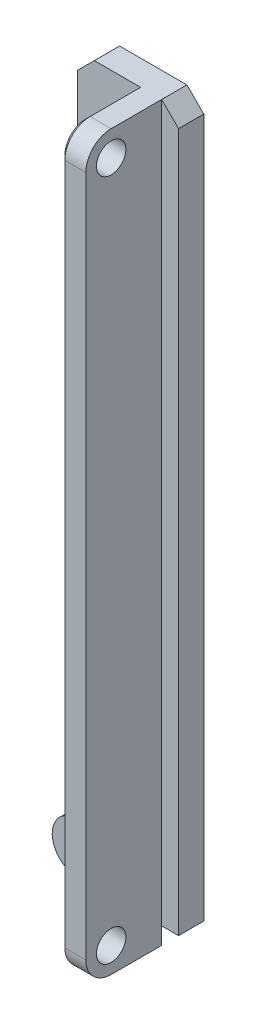
ISO-10303-21;
HEADER;
FILE_DESCRIPTION(('STEP AP214'),'2;1');
FILE_NAME('part.step','',(''),(''),'','','');
FILE_SCHEMA(('AUTOMOTIVE_DESIGN { 1 0 10303 214 1 1 1 1 }'));
ENDSEC;
DATA;
#1=APPLICATION_CONTEXT('core data for automotive mechanical design processes');
#2=APPLICATION_PROTOCOL_DEFINITION('international standard','automotive_design',2000,#1);
#3=PRODUCT_CONTEXT('',#1,'mechanical');
#4=PRODUCT('Part','Part','',(#3));
#5=PRODUCT_RELATED_PRODUCT_CATEGORY('part','',(#4));
#6=PRODUCT_DEFINITION_FORMATION('','',#4);
#7=PRODUCT_DEFINITION_CONTEXT('part definition',#1,'design');
#8=PRODUCT_DEFINITION('design','',#6,#7);
#9=PRODUCT_DEFINITION_SHAPE('','',#8);
#10=(LENGTH_UNIT() NAMED_UNIT(*) SI_UNIT(.MILLI.,.METRE.));
#11=(NAMED_UNIT(*) PLANE_ANGLE_UNIT() SI_UNIT($,.RADIAN.));
#12=(NAMED_UNIT(*) SI_UNIT($,.STERADIAN.) SOLID_ANGLE_UNIT());
#13=UNCERTAINTY_MEASURE_WITH_UNIT(LENGTH_MEASURE(1.E-05),#10,'distance_accuracy_value','');
#14=(GEOMETRIC_REPRESENTATION_CONTEXT(3) GLOBAL_UNCERTAINTY_ASSIGNED_CONTEXT((#13)) GLOBAL_UNIT_ASSIGNED_CONTEXT((#10,
#11,#12)) REPRESENTATION_CONTEXT('',''));
#15=CARTESIAN_POINT('',(0.,0.,0.));
#16=DIRECTION('',(0.,0.,1.));
#17=DIRECTION('',(1.,0.,0.));
#18=AXIS2_PLACEMENT_3D('',#15,#16,#17);
#19=CARTESIAN_POINT('',(-6.99999992549419,-10.,-6.));
#20=DIRECTION('',(0.,0.,1.));
#21=DIRECTION('',(1.,0.,0.));
#22=AXIS2_PLACEMENT_3D('',#19,#20,#21);
#23=PLANE('',#22);
#24=DIRECTION('',(0.,1.,0.));
#25=VECTOR('',#24,1.);
#26=CARTESIAN_POINT('',(5.00000007450581,-13.,-6.));
#27=LINE('',#26,#25);
#28=CARTESIAN_POINT('',(5.00000007450581,-13.,-6.));
#29=VERTEX_POINT('',#28);
#30=CARTESIAN_POINT('',(5.00000007450581,69.9999999971164,-6.));
#31=VERTEX_POINT('',#30);
#32=EDGE_CURVE('E215',#29,#31,#27,.T.);
#33=ORIENTED_EDGE('',*,*,#32,.T.);
#34=DIRECTION('',(0.707106591525709,-0.707106970847335,0.));
#35=VECTOR('',#34,1.);
#36=CARTESIAN_POINT('',(39.000003291709,35.9999785408858,-6.));
#37=LINE('',#36,#35);
#38=CARTESIAN_POINT('',(3.,72.0000010728836,-6.));
#39=VERTEX_POINT('',#38);
#40=EDGE_CURVE('E209',#31,#39,#37,.F.);
#41=ORIENTED_EDGE('',*,*,#40,.T.);
#42=DIRECTION('',(0.,-1.,0.));
#43=VECTOR('',#42,1.);
#44=CARTESIAN_POINT('',(3.,72.0000010728836,-6.));
#45=LINE('',#44,#43);
#46=CARTESIAN_POINT('',(3.,-13.,-6.));
#47=VERTEX_POINT('',#46);
#48=EDGE_CURVE('E212',#39,#47,#45,.T.);
#49=ORIENTED_EDGE('',*,*,#48,.T.);
#50=DIRECTION('',(1.,0.,0.));
#51=VECTOR('',#50,1.);
#52=CARTESIAN_POINT('',(-6.9999999254942,-13.,-6.));
#53=LINE('',#52,#51);
#54=EDGE_CURVE('E392',#47,#29,#53,.T.);
#55=ORIENTED_EDGE('',*,*,#54,.T.);
#56=EDGE_LOOP('',(#33,#41,#49,#55));
#57=FACE_BOUND('',#56,.T.);
#58=ADVANCED_FACE('F35',(#57),#23,.T.);
#59=CARTESIAN_POINT('',(-6.9999999254942,-13.,-9.));
#60=DIRECTION('',(0.,-1.,0.));
#61=DIRECTION('',(0.,0.,-1.));
#62=AXIS2_PLACEMENT_3D('',#59,#60,#61);
#63=PLANE('',#62);
#64=DIRECTION('',(0.,0.,-1.));
#65=VECTOR('',#64,1.);
#66=CARTESIAN_POINT('',(0.,-13.,-6.));
#67=LINE('',#66,#65);
#68=CARTESIAN_POINT('',(0.,-13.,-6.));
#69=VERTEX_POINT('',#68);
#70=CARTESIAN_POINT('',(0.,-13.,-9.));
#71=VERTEX_POINT('',#70);
#72=EDGE_CURVE('E343',#69,#71,#67,.T.);
#73=ORIENTED_EDGE('',*,*,#72,.T.);
#74=DIRECTION('',(1.,0.,0.));
#75=VECTOR('',#74,1.);
#76=CARTESIAN_POINT('',(-6.9999999254942,-13.,-9.));
#77=LINE('',#76,#75);
#78=CARTESIAN_POINT('',(5.00000007450581,-13.,-9.));
#79=VERTEX_POINT('',#78);
#80=EDGE_CURVE('E380',#71,#79,#77,.T.);
#81=ORIENTED_EDGE('',*,*,#80,.T.);
#82=DIRECTION('',(0.,0.,1.));
#83=VECTOR('',#82,1.);
#84=CARTESIAN_POINT('',(5.00000007450581,-13.,-9.));
#85=LINE('',#84,#83);
#86=EDGE_CURVE('E396',#79,#29,#85,.T.);
#87=ORIENTED_EDGE('',*,*,#86,.T.);
#88=ORIENTED_EDGE('',*,*,#54,.F.);
#89=EDGE_CURVE('E395',#69,#47,#53,.T.);
#90=ORIENTED_EDGE('',*,*,#89,.F.);
#91=EDGE_LOOP('',(#73,#81,#87,#88,#90));
#92=FACE_BOUND('',#91,.T.);
#93=ADVANCED_FACE('F483',(#92),#63,.T.);
#94=CARTESIAN_POINT('',(-6.99999992549421,72.00000107,-9.));
#95=DIRECTION('',(-1.,0.,0.));
#96=DIRECTION('',(0.,-1.,0.));
#97=AXIS2_PLACEMENT_3D('',#94,#95,#96);
#98=PLANE('',#97);
#99=DIRECTION('',(0.,-1.,0.));
#100=VECTOR('',#99,1.);
#101=CARTESIAN_POINT('',(-6.99999992549421,72.00000107,-6.));
#102=LINE('',#101,#100);
#103=CARTESIAN_POINT('',(-6.9999999254942,0.,-6.));
#104=VERTEX_POINT('',#103);
#105=CARTESIAN_POINT('',(-6.9999999254942,-7.,-6.));
#106=VERTEX_POINT('',#105);
#107=EDGE_CURVE('E387',#104,#106,#102,.T.);
#108=ORIENTED_EDGE('',*,*,#107,.F.);
#109=DIRECTION('',(0.,0.,1.));
#110=VECTOR('',#109,1.);
#111=CARTESIAN_POINT('',(-6.9999999254942,0.,-6.));
#112=LINE('',#111,#110);
#113=CARTESIAN_POINT('',(-6.9999999254942,0.,-9.));
#114=VERTEX_POINT('',#113);
#115=EDGE_CURVE('E346',#114,#104,#112,.T.);
#116=ORIENTED_EDGE('',*,*,#115,.F.);
#117=DIRECTION('',(0.,-1.,0.));
#118=VECTOR('',#117,1.);
#119=CARTESIAN_POINT('',(-6.99999992549421,72.00000107,-9.));
#120=LINE('',#119,#118);
#121=CARTESIAN_POINT('',(-6.9999999254942,-7.,-9.));
#122=VERTEX_POINT('',#121);
#123=EDGE_CURVE('E375',#114,#122,#120,.T.);
#124=ORIENTED_EDGE('',*,*,#123,.T.);
#125=DIRECTION('',(0.,0.,1.));
#126=VECTOR('',#125,1.);
#127=CARTESIAN_POINT('',(-6.9999999254942,-7.,-9.));
#128=LINE('',#127,#126);
#129=EDGE_CURVE('E384',#122,#106,#128,.T.);
#130=ORIENTED_EDGE('',*,*,#129,.T.);
#131=EDGE_LOOP('',(#108,#116,#124,#130));
#132=FACE_BOUND('',#131,.T.);
#133=ADVANCED_FACE('F485',(#132),#98,.T.);
#134=CARTESIAN_POINT('',(5.00000007450581,-13.,-9.));
#135=DIRECTION('',(1.,0.,0.));
#136=DIRECTION('',(0.,0.,-1.));
#137=AXIS2_PLACEMENT_3D('',#134,#135,#136);
#138=PLANE('',#137);
#139=DIRECTION('',(0.,1.,0.));
#140=VECTOR('',#139,1.);
#141=CARTESIAN_POINT('',(5.00000007450581,-13.,-9.));
#142=LINE('',#141,#140);
#143=CARTESIAN_POINT('',(5.00000007450581,69.9999999971164,-9.));
#144=VERTEX_POINT('',#143);
#145=EDGE_CURVE('E369',#79,#144,#142,.T.);
#146=ORIENTED_EDGE('',*,*,#145,.T.);
#147=DIRECTION('',(0.,0.,1.));
#148=VECTOR('',#147,1.);
#149=CARTESIAN_POINT('',(5.00000007450581,69.9999999971164,-9.));
#150=LINE('',#149,#148);
#151=EDGE_CURVE('E221',#144,#31,#150,.T.);
#152=ORIENTED_EDGE('',*,*,#151,.T.);
#153=ORIENTED_EDGE('',*,*,#32,.F.);
#154=ORIENTED_EDGE('',*,*,#86,.F.);
#155=EDGE_LOOP('',(#146,#152,#153,#154));
#156=FACE_BOUND('',#155,.T.);
#157=ADVANCED_FACE('F432',(#156),#138,.T.);
#158=DIRECTION('',(0.,0.,-1.));
#159=VECTOR('',#158,1.);
#160=CARTESIAN_POINT('',(-3.,-13.,-6.));
#161=LINE('',#160,#159);
#162=CARTESIAN_POINT('',(-3.,-13.,-6.));
#163=VERTEX_POINT('',#162);
#164=CARTESIAN_POINT('',(-3.,-13.,-9.));
#165=VERTEX_POINT('',#164);
#166=EDGE_CURVE('E330',#163,#165,#161,.T.);
#167=ORIENTED_EDGE('',*,*,#166,.F.);
#168=CARTESIAN_POINT('',(-6.9999999254942,-13.,-6.));
#169=VERTEX_POINT('',#168);
#170=EDGE_CURVE('E373',#169,#163,#53,.T.);
#171=ORIENTED_EDGE('',*,*,#170,.F.);
#172=DIRECTION('',(0.,0.,1.));
#173=VECTOR('',#172,1.);
#174=CARTESIAN_POINT('',(-6.9999999254942,-13.,-9.));
#175=LINE('',#174,#173);
#176=CARTESIAN_POINT('',(-6.9999999254942,-13.,-9.));
#177=VERTEX_POINT('',#176);
#178=EDGE_CURVE('E400',#177,#169,#175,.T.);
#179=ORIENTED_EDGE('',*,*,#178,.F.);
#180=EDGE_CURVE('E381',#177,#165,#77,.T.);
#181=ORIENTED_EDGE('',*,*,#180,.T.);
#182=EDGE_LOOP('',(#167,#171,#179,#181));
#183=FACE_BOUND('',#182,.T.);
#184=ADVANCED_FACE('F487',(#183),#63,.T.);
#185=CARTESIAN_POINT('',(-6.99999992549419,-10.,-9.));
#186=DIRECTION('',(0.,0.,1.));
#187=DIRECTION('',(1.,0.,0.));
#188=AXIS2_PLACEMENT_3D('',#185,#186,#187);
#189=CYLINDRICAL_SURFACE('',#188,3.);
#190=CARTESIAN_POINT('',(-6.99999992549419,-10.,-6.));
#191=DIRECTION('',(0.,0.,1.));
#192=DIRECTION('',(1.,0.,0.));
#193=AXIS2_PLACEMENT_3D('',#190,#191,#192);
#194=CIRCLE('',#193,3.);
#195=EDGE_CURVE('E389',#106,#169,#194,.T.);
#196=ORIENTED_EDGE('',*,*,#195,.F.);
#197=ORIENTED_EDGE('',*,*,#129,.F.);
#198=CARTESIAN_POINT('',(-6.99999992549419,-10.,-9.));
#199=DIRECTION('',(0.,0.,1.));
#200=DIRECTION('',(1.,0.,0.));
#201=AXIS2_PLACEMENT_3D('',#198,#199,#200);
#202=CIRCLE('',#201,3.);
#203=EDGE_CURVE('E377',#122,#177,#202,.T.);
#204=ORIENTED_EDGE('',*,*,#203,.T.);
#205=ORIENTED_EDGE('',*,*,#178,.T.);
#206=EDGE_LOOP('',(#196,#197,#204,#205));
#207=FACE_BOUND('',#206,.T.);
#208=ADVANCED_FACE('F497',(#207),#189,.T.);
#209=CARTESIAN_POINT('',(5.00000007450581,72.00000107,-9.));
#210=DIRECTION('',(0.,1.,0.));
#211=DIRECTION('',(0.,0.,1.));
#212=AXIS2_PLACEMENT_3D('',#209,#210,#211);
#213=PLANE('',#212);
#214=DIRECTION('',(-1.,0.,0.));
#215=VECTOR('',#214,1.);
#216=CARTESIAN_POINT('',(5.00000007450581,72.00000107,-6.));
#217=LINE('',#216,#215);
#218=CARTESIAN_POINT('',(0.49999999711639,72.00000107,-6.));
#219=VERTEX_POINT('',#218);
#220=CARTESIAN_POINT('',(-4.99999992837809,72.00000107,-6.));
#221=VERTEX_POINT('',#220);
#222=EDGE_CURVE('E53',#219,#221,#217,.T.);
#223=ORIENTED_EDGE('',*,*,#222,.F.);
#224=DIRECTION('',(0.,0.,1.));
#225=VECTOR('',#224,1.);
#226=CARTESIAN_POINT('',(0.49999999711639,72.00000107,0.));
#227=LINE('',#226,#225);
#228=CARTESIAN_POINT('',(0.49999999711639,72.00000107,0.));
#229=VERTEX_POINT('',#228);
#230=EDGE_CURVE('E45',#219,#229,#227,.T.);
#231=ORIENTED_EDGE('',*,*,#230,.T.);
#232=DIRECTION('',(-1.,0.,0.));
#233=VECTOR('',#232,1.);
#234=CARTESIAN_POINT('',(5.00000007450581,72.00000107,0.));
#235=LINE('',#234,#233);
#236=CARTESIAN_POINT('',(3.,72.0000010728836,0.));
#237=VERTEX_POINT('',#236);
#238=EDGE_CURVE('E227',#229,#237,#235,.F.);
#239=ORIENTED_EDGE('',*,*,#238,.T.);
#240=DIRECTION('',(0.,0.,-1.));
#241=VECTOR('',#240,1.);
#242=CARTESIAN_POINT('',(3.,72.0000010728836,3.00000000000001));
#243=LINE('',#242,#241);
#244=EDGE_CURVE('E224',#237,#39,#243,.T.);
#245=ORIENTED_EDGE('',*,*,#244,.T.);
#246=DIRECTION('',(0.,0.,-1.));
#247=VECTOR('',#246,1.);
#248=CARTESIAN_POINT('',(3.00000007450608,72.00000107,-9.));
#249=LINE('',#248,#247);
#250=CARTESIAN_POINT('',(3.00000007450608,72.00000107,-9.));
#251=VERTEX_POINT('',#250);
#252=EDGE_CURVE('E220',#39,#251,#249,.T.);
#253=ORIENTED_EDGE('',*,*,#252,.T.);
#254=DIRECTION('',(-1.,0.,0.));
#255=VECTOR('',#254,1.);
#256=CARTESIAN_POINT('',(5.00000007450581,72.00000107,-9.));
#257=LINE('',#256,#255);
#258=CARTESIAN_POINT('',(-4.99999992837809,72.00000107,-9.));
#259=VERTEX_POINT('',#258);
#260=EDGE_CURVE('E372',#251,#259,#257,.T.);
#261=ORIENTED_EDGE('',*,*,#260,.T.);
#262=DIRECTION('',(0.,0.,1.));
#263=VECTOR('',#262,1.);
#264=CARTESIAN_POINT('',(-4.99999992837809,72.00000107,-6.));
#265=LINE('',#264,#263);
#266=EDGE_CURVE('E423',#259,#221,#265,.T.);
#267=ORIENTED_EDGE('',*,*,#266,.T.);
#268=EDGE_LOOP('',(#223,#231,#239,#245,#253,#261,#267));
#269=FACE_BOUND('',#268,.T.);
#270=ADVANCED_FACE('F225',(#269),#213,.T.);
#271=CARTESIAN_POINT('',(-6.99999992549419,-10.,-9.));
#272=DIRECTION('',(0.,0.,1.));
#273=DIRECTION('',(1.,0.,0.));
#274=AXIS2_PLACEMENT_3D('',#271,#272,#273);
#275=PLANE('',#274);
#276=ORIENTED_EDGE('',*,*,#260,.F.);
#277=DIRECTION('',(-0.707106591525709,0.707106970847335,0.));
#278=VECTOR('',#277,1.);
#279=CARTESIAN_POINT('',(5.00000007450581,69.9999999971164,-9.));
#280=LINE('',#279,#278);
#281=EDGE_CURVE('E240',#251,#144,#280,.F.);
#282=ORIENTED_EDGE('',*,*,#281,.T.);
#283=ORIENTED_EDGE('',*,*,#145,.F.);
#284=ORIENTED_EDGE('',*,*,#80,.F.);
#285=DIRECTION('',(0.,-1.,0.));
#286=VECTOR('',#285,1.);
#287=CARTESIAN_POINT('',(0.,17.,-9.));
#288=LINE('',#287,#286);
#289=CARTESIAN_POINT('',(0.,17.,-9.));
#290=VERTEX_POINT('',#289);
#291=EDGE_CURVE('E321',#290,#71,#288,.T.);
#292=ORIENTED_EDGE('',*,*,#291,.F.);
#293=DIRECTION('',(1.,0.,0.));
#294=VECTOR('',#293,1.);
#295=CARTESIAN_POINT('',(-4.5,17.,-9.));
#296=LINE('',#295,#294);
#297=CARTESIAN_POINT('',(-4.5,17.,-9.));
#298=VERTEX_POINT('',#297);
#299=EDGE_CURVE('E339',#298,#290,#296,.T.);
#300=ORIENTED_EDGE('',*,*,#299,.F.);
#301=DIRECTION('',(0.,1.,0.));
#302=VECTOR('',#301,1.);
#303=CARTESIAN_POINT('',(-4.5,15.,-9.));
#304=LINE('',#303,#302);
#305=CARTESIAN_POINT('',(-4.5,15.,-9.));
#306=VERTEX_POINT('',#305);
#307=EDGE_CURVE('E336',#306,#298,#304,.T.);
#308=ORIENTED_EDGE('',*,*,#307,.F.);
#309=DIRECTION('',(-1.,0.,0.));
#310=VECTOR('',#309,1.);
#311=CARTESIAN_POINT('',(-3.,15.,-9.));
#312=LINE('',#311,#310);
#313=CARTESIAN_POINT('',(-3.,15.,-9.));
#314=VERTEX_POINT('',#313);
#315=EDGE_CURVE('E333',#314,#306,#312,.T.);
#316=ORIENTED_EDGE('',*,*,#315,.F.);
#317=DIRECTION('',(0.,1.,0.));
#318=VECTOR('',#317,1.);
#319=CARTESIAN_POINT('',(-3.,-13.,-9.));
#320=LINE('',#319,#318);
#321=EDGE_CURVE('E316',#165,#314,#320,.T.);
#322=ORIENTED_EDGE('',*,*,#321,.F.);
#323=ORIENTED_EDGE('',*,*,#180,.F.);
#324=ORIENTED_EDGE('',*,*,#203,.F.);
#325=ORIENTED_EDGE('',*,*,#123,.F.);
#326=DIRECTION('',(1.,0.,0.));
#327=VECTOR('',#326,1.);
#328=CARTESIAN_POINT('',(-8.49999992549419,0.,-9.));
#329=LINE('',#328,#327);
#330=CARTESIAN_POINT('',(-8.49999992549419,0.,-9.));
#331=VERTEX_POINT('',#330);
#332=EDGE_CURVE('E367',#331,#114,#329,.T.);
#333=ORIENTED_EDGE('',*,*,#332,.F.);
#334=DIRECTION('',(0.,-1.,0.));
#335=VECTOR('',#334,1.);
#336=CARTESIAN_POINT('',(-8.49999992549419,0.,-9.));
#337=LINE('',#336,#335);
#338=CARTESIAN_POINT('',(-8.49999992549419,1.49999999999999,-9.));
#339=VERTEX_POINT('',#338);
#340=EDGE_CURVE('E356',#339,#331,#337,.T.);
#341=ORIENTED_EDGE('',*,*,#340,.F.);
#342=DIRECTION('',(-0.707106781186544,-0.707106781186551,0.));
#343=VECTOR('',#342,1.);
#344=CARTESIAN_POINT('',(-13.4999999254942,-3.50000000000006,-9.));
#345=LINE('',#344,#343);
#346=CARTESIAN_POINT('',(-6.99999992549419,3.,-9.));
#347=VERTEX_POINT('',#346);
#348=EDGE_CURVE('E310',#339,#347,#345,.F.);
#349=ORIENTED_EDGE('',*,*,#348,.T.);
#350=DIRECTION('',(0.,1.,0.));
#351=VECTOR('',#350,1.);
#352=CARTESIAN_POINT('',(-6.99999992549419,3.,-9.));
#353=LINE('',#352,#351);
#354=CARTESIAN_POINT('',(-6.9999999254942,70.,-9.));
#355=VERTEX_POINT('',#354);
#356=EDGE_CURVE('E306',#347,#355,#353,.T.);
#357=ORIENTED_EDGE('',*,*,#356,.T.);
#358=DIRECTION('',(0.707106591525701,0.707106970847343,0.));
#359=VECTOR('',#358,1.);
#360=CARTESIAN_POINT('',(-4.99999992837809,72.00000107,-9.));
#361=LINE('',#360,#359);
#362=EDGE_CURVE('E429',#355,#259,#361,.T.);
#363=ORIENTED_EDGE('',*,*,#362,.T.);
#364=EDGE_LOOP('',(#276,#282,#283,#284,#292,#300,#308,#316,#322,#323,#324,#325,#333,#341,#349,
#357,#363));
#365=FACE_BOUND('',#364,.T.);
#366=ADVANCED_FACE('F437',(#365),#275,.F.);
#367=ORIENTED_EDGE('',*,*,#222,.T.);
#368=DIRECTION('',(-0.707106591525701,-0.707106970847343,0.));
#369=VECTOR('',#368,1.);
#370=CARTESIAN_POINT('',(-46.9999999254884,29.9999785423276,-6.));
#371=LINE('',#370,#369);
#372=CARTESIAN_POINT('',(-6.9999999254942,70.,-6.));
#373=VERTEX_POINT('',#372);
#374=EDGE_CURVE('E425',#221,#373,#371,.T.);
#375=ORIENTED_EDGE('',*,*,#374,.T.);
#376=DIRECTION('',(0.,1.,0.));
#377=VECTOR('',#376,1.);
#378=CARTESIAN_POINT('',(-6.99999992549419,3.,-6.));
#379=LINE('',#378,#377);
#380=CARTESIAN_POINT('',(-6.99999992549419,3.,-6.));
#381=VERTEX_POINT('',#380);
#382=EDGE_CURVE('E311',#381,#373,#379,.T.);
#383=ORIENTED_EDGE('',*,*,#382,.F.);
#384=DIRECTION('',(-0.707106781186544,-0.707106781186551,0.));
#385=VECTOR('',#384,1.);
#386=CARTESIAN_POINT('',(-13.4999999254942,-3.50000000000006,-6.));
#387=LINE('',#386,#385);
#388=CARTESIAN_POINT('',(-8.49999992549419,1.49999999999999,-6.));
#389=VERTEX_POINT('',#388);
#390=EDGE_CURVE('E305',#389,#381,#387,.F.);
#391=ORIENTED_EDGE('',*,*,#390,.F.);
#392=DIRECTION('',(0.,1.,0.));
#393=VECTOR('',#392,1.);
#394=CARTESIAN_POINT('',(-8.49999992549419,72.0000010728836,-6.));
#395=LINE('',#394,#393);
#396=CARTESIAN_POINT('',(-8.49999992549419,0.,-6.));
#397=VERTEX_POINT('',#396);
#398=EDGE_CURVE('E360',#397,#389,#395,.T.);
#399=ORIENTED_EDGE('',*,*,#398,.F.);
#400=DIRECTION('',(1.,0.,0.));
#401=VECTOR('',#400,1.);
#402=CARTESIAN_POINT('',(-8.49999992549419,0.,-6.));
#403=LINE('',#402,#401);
#404=EDGE_CURVE('E363',#397,#104,#403,.T.);
#405=ORIENTED_EDGE('',*,*,#404,.T.);
#406=ORIENTED_EDGE('',*,*,#107,.T.);
#407=ORIENTED_EDGE('',*,*,#195,.T.);
#408=ORIENTED_EDGE('',*,*,#170,.T.);
#409=DIRECTION('',(0.,1.,0.));
#410=VECTOR('',#409,1.);
#411=CARTESIAN_POINT('',(-3.,-13.,-6.));
#412=LINE('',#411,#410);
#413=CARTESIAN_POINT('',(-3.,15.,-6.));
#414=VERTEX_POINT('',#413);
#415=EDGE_CURVE('E317',#163,#414,#412,.T.);
#416=ORIENTED_EDGE('',*,*,#415,.T.);
#417=DIRECTION('',(-1.,0.,0.));
#418=VECTOR('',#417,1.);
#419=CARTESIAN_POINT('',(-3.,15.,-6.));
#420=LINE('',#419,#418);
#421=CARTESIAN_POINT('',(-4.5,15.,-6.));
#422=VERTEX_POINT('',#421);
#423=EDGE_CURVE('E320',#414,#422,#420,.T.);
#424=ORIENTED_EDGE('',*,*,#423,.T.);
#425=DIRECTION('',(0.,1.,0.));
#426=VECTOR('',#425,1.);
#427=CARTESIAN_POINT('',(-4.5,15.,-6.));
#428=LINE('',#427,#426);
#429=CARTESIAN_POINT('',(-4.5,17.,-6.));
#430=VERTEX_POINT('',#429);
#431=EDGE_CURVE('E324',#422,#430,#428,.T.);
#432=ORIENTED_EDGE('',*,*,#431,.T.);
#433=DIRECTION('',(1.,0.,0.));
#434=VECTOR('',#433,1.);
#435=CARTESIAN_POINT('',(-4.5,17.,-6.));
#436=LINE('',#435,#434);
#437=CARTESIAN_POINT('',(0.,17.,-6.));
#438=VERTEX_POINT('',#437);
#439=EDGE_CURVE('E327',#430,#438,#436,.T.);
#440=ORIENTED_EDGE('',*,*,#439,.T.);
#441=DIRECTION('',(0.,-1.,0.));
#442=VECTOR('',#441,1.);
#443=CARTESIAN_POINT('',(0.,72.0000010728836,-6.));
#444=LINE('',#443,#442);
#445=CARTESIAN_POINT('',(0.,71.5000010728836,-6.));
#446=VERTEX_POINT('',#445);
#447=EDGE_CURVE('E296',#446,#438,#444,.T.);
#448=ORIENTED_EDGE('',*,*,#447,.F.);
#449=DIRECTION('',(0.707106781186548,0.707106781186548,0.));
#450=VECTOR('',#449,1.);
#451=CARTESIAN_POINT('',(0.,71.5000010728836,-6.));
#452=LINE('',#451,#450);
#453=EDGE_CURVE('E11',#446,#219,#452,.T.);
#454=ORIENTED_EDGE('',*,*,#453,.T.);
#455=EDGE_LOOP('',(#367,#375,#383,#391,#399,#405,#406,#407,#408,#416,#424,#432,#440,#448,#454));
#456=FACE_BOUND('',#455,.T.);
#457=ADVANCED_FACE('F443',(#456),#23,.T.);
#458=CARTESIAN_POINT('',(-8.49999992549419,0.,-6.));
#459=DIRECTION('',(0.,1.,0.));
#460=DIRECTION('',(0.,0.,1.));
#461=AXIS2_PLACEMENT_3D('',#458,#459,#460);
#462=PLANE('',#461);
#463=ORIENTED_EDGE('',*,*,#115,.T.);
#464=ORIENTED_EDGE('',*,*,#404,.F.);
#465=DIRECTION('',(0.,0.,1.));
#466=VECTOR('',#465,1.);
#467=CARTESIAN_POINT('',(-8.49999992549419,0.,-6.));
#468=LINE('',#467,#466);
#469=EDGE_CURVE('E358',#331,#397,#468,.T.);
#470=ORIENTED_EDGE('',*,*,#469,.F.);
#471=ORIENTED_EDGE('',*,*,#332,.T.);
#472=EDGE_LOOP('',(#463,#464,#470,#471));
#473=FACE_BOUND('',#472,.T.);
#474=ADVANCED_FACE('F576',(#473),#462,.F.);
#475=CARTESIAN_POINT('',(-8.49999992549419,0.,0.));
#476=DIRECTION('',(1.,0.,0.));
#477=DIRECTION('',(0.,0.,-1.));
#478=AXIS2_PLACEMENT_3D('',#475,#476,#477);
#479=PLANE('',#478);
#480=ORIENTED_EDGE('',*,*,#398,.T.);
#481=DIRECTION('',(0.,0.,-1.));
#482=VECTOR('',#481,1.);
#483=CARTESIAN_POINT('',(-8.49999992549419,1.49999999999999,-9.));
#484=LINE('',#483,#482);
#485=EDGE_CURVE('E309',#339,#389,#484,.F.);
#486=ORIENTED_EDGE('',*,*,#485,.F.);
#487=ORIENTED_EDGE('',*,*,#340,.T.);
#488=ORIENTED_EDGE('',*,*,#469,.T.);
#489=EDGE_LOOP('',(#480,#486,#487,#488));
#490=FACE_BOUND('',#489,.T.);
#491=ADVANCED_FACE('F580',(#490),#479,.F.);
#492=CARTESIAN_POINT('',(0.,17.,-6.));
#493=DIRECTION('',(1.,0.,0.));
#494=DIRECTION('',(0.,0.,-1.));
#495=AXIS2_PLACEMENT_3D('',#492,#493,#494);
#496=PLANE('',#495);
#497=CARTESIAN_POINT('',(0.,69.0000010728836,0.));
#498=DIRECTION('',(-1.,0.,0.));
#499=DIRECTION('',(0.,0.,1.));
#500=AXIS2_PLACEMENT_3D('',#497,#498,#499);
#501=CIRCLE('',#500,1.75);
#502=CARTESIAN_POINT('',(0.,69.0000010728836,1.75));
#503=VERTEX_POINT('',#502);
#504=EDGE_CURVE('E278',#503,#503,#501,.T.);
#505=ORIENTED_EDGE('',*,*,#504,.F.);
#506=EDGE_LOOP('',(#505));
#507=FACE_BOUND('',#506,.T.);
#508=CARTESIAN_POINT('',(0.,-11.9999989271164,0.));
#509=DIRECTION('',(-1.,0.,0.));
#510=DIRECTION('',(0.,0.,1.));
#511=AXIS2_PLACEMENT_3D('',#508,#509,#510);
#512=CIRCLE('',#511,1.75);
#513=CARTESIAN_POINT('',(0.,-11.9999989271164,1.75));
#514=VERTEX_POINT('',#513);
#515=EDGE_CURVE('E289',#514,#514,#512,.T.);
#516=ORIENTED_EDGE('',*,*,#515,.F.);
#517=EDGE_LOOP('',(#516));
#518=FACE_BOUND('',#517,.T.);
#519=CARTESIAN_POINT('',(0.,-14.49999893,-6.));
#520=VERTEX_POINT('',#519);
#521=EDGE_CURVE('E302',#69,#520,#444,.T.);
#522=ORIENTED_EDGE('',*,*,#521,.T.);
#523=DIRECTION('',(0.,0.,1.));
#524=VECTOR('',#523,1.);
#525=CARTESIAN_POINT('',(0.,-14.49999893,0.));
#526=LINE('',#525,#524);
#527=CARTESIAN_POINT('',(0.,-14.49999893,0.));
#528=VERTEX_POINT('',#527);
#529=EDGE_CURVE('E253',#520,#528,#526,.T.);
#530=ORIENTED_EDGE('',*,*,#529,.T.);
#531=CARTESIAN_POINT('',(0.,-11.9999989271164,0.));
#532=DIRECTION('',(1.,0.,0.));
#533=DIRECTION('',(0.,0.,-1.));
#534=AXIS2_PLACEMENT_3D('',#531,#532,#533);
#535=CIRCLE('',#534,2.50000000288361);
#536=CARTESIAN_POINT('',(0.,-11.9999989271164,2.50000000288362));
#537=VERTEX_POINT('',#536);
#538=EDGE_CURVE('E251',#528,#537,#535,.F.);
#539=ORIENTED_EDGE('',*,*,#538,.T.);
#540=DIRECTION('',(0.,1.,0.));
#541=VECTOR('',#540,1.);
#542=CARTESIAN_POINT('',(0.,69.00000107,2.50000000288362));
#543=LINE('',#542,#541);
#544=CARTESIAN_POINT('',(0.,69.00000107,2.50000000288362));
#545=VERTEX_POINT('',#544);
#546=EDGE_CURVE('E249',#537,#545,#543,.T.);
#547=ORIENTED_EDGE('',*,*,#546,.T.);
#548=CARTESIAN_POINT('',(0.,69.00000107,0.));
#549=DIRECTION('',(1.,0.,0.));
#550=DIRECTION('',(0.,0.,-1.));
#551=AXIS2_PLACEMENT_3D('',#548,#549,#550);
#552=CIRCLE('',#551,2.50000000288361);
#553=CARTESIAN_POINT('',(0.,71.5000010728836,0.));
#554=VERTEX_POINT('',#553);
#555=EDGE_CURVE('E247',#545,#554,#552,.F.);
#556=ORIENTED_EDGE('',*,*,#555,.T.);
#557=DIRECTION('',(0.,0.,-1.));
#558=VECTOR('',#557,1.);
#559=CARTESIAN_POINT('',(0.,71.5000010728836,-6.));
#560=LINE('',#559,#558);
#561=EDGE_CURVE('E242',#554,#446,#560,.T.);
#562=ORIENTED_EDGE('',*,*,#561,.T.);
#563=ORIENTED_EDGE('',*,*,#447,.T.);
#564=DIRECTION('',(0.,0.,-1.));
#565=VECTOR('',#564,1.);
#566=CARTESIAN_POINT('',(0.,17.,-6.));
#567=LINE('',#566,#565);
#568=EDGE_CURVE('E347',#438,#290,#567,.T.);
#569=ORIENTED_EDGE('',*,*,#568,.T.);
#570=ORIENTED_EDGE('',*,*,#291,.T.);
#571=ORIENTED_EDGE('',*,*,#72,.F.);
#572=EDGE_LOOP('',(#522,#530,#539,#547,#556,#562,#563,#569,#570,#571));
#573=FACE_BOUND('',#572,.T.);
#574=ADVANCED_FACE('F477',(#507,#518,#573),#496,.F.);
#575=CARTESIAN_POINT('',(-4.5,17.,-6.));
#576=DIRECTION('',(0.,1.,0.));
#577=DIRECTION('',(0.,0.,1.));
#578=AXIS2_PLACEMENT_3D('',#575,#576,#577);
#579=PLANE('',#578);
#580=ORIENTED_EDGE('',*,*,#299,.T.);
#581=ORIENTED_EDGE('',*,*,#568,.F.);
#582=ORIENTED_EDGE('',*,*,#439,.F.);
#583=DIRECTION('',(0.,0.,-1.));
#584=VECTOR('',#583,1.);
#585=CARTESIAN_POINT('',(-4.5,17.,-6.));
#586=LINE('',#585,#584);
#587=EDGE_CURVE('E349',#430,#298,#586,.T.);
#588=ORIENTED_EDGE('',*,*,#587,.T.);
#589=EDGE_LOOP('',(#580,#581,#582,#588));
#590=FACE_BOUND('',#589,.T.);
#591=ADVANCED_FACE('F528',(#590),#579,.F.);
#592=CARTESIAN_POINT('',(-4.5,15.,-6.));
#593=DIRECTION('',(-1.,0.,0.));
#594=DIRECTION('',(0.,0.,1.));
#595=AXIS2_PLACEMENT_3D('',#592,#593,#594);
#596=PLANE('',#595);
#597=ORIENTED_EDGE('',*,*,#307,.T.);
#598=ORIENTED_EDGE('',*,*,#587,.F.);
#599=ORIENTED_EDGE('',*,*,#431,.F.);
#600=DIRECTION('',(0.,0.,-1.));
#601=VECTOR('',#600,1.);
#602=CARTESIAN_POINT('',(-4.5,15.,-6.));
#603=LINE('',#602,#601);
#604=EDGE_CURVE('E351',#422,#306,#603,.T.);
#605=ORIENTED_EDGE('',*,*,#604,.T.);
#606=EDGE_LOOP('',(#597,#598,#599,#605));
#607=FACE_BOUND('',#606,.T.);
#608=ADVANCED_FACE('F524',(#607),#596,.F.);
#609=CARTESIAN_POINT('',(-3.,15.,-6.));
#610=DIRECTION('',(0.,-1.,0.));
#611=DIRECTION('',(0.,0.,-1.));
#612=AXIS2_PLACEMENT_3D('',#609,#610,#611);
#613=PLANE('',#612);
#614=ORIENTED_EDGE('',*,*,#315,.T.);
#615=ORIENTED_EDGE('',*,*,#604,.F.);
#616=ORIENTED_EDGE('',*,*,#423,.F.);
#617=DIRECTION('',(0.,0.,-1.));
#618=VECTOR('',#617,1.);
#619=CARTESIAN_POINT('',(-3.,15.,-6.));
#620=LINE('',#619,#618);
#621=EDGE_CURVE('E353',#414,#314,#620,.T.);
#622=ORIENTED_EDGE('',*,*,#621,.T.);
#623=EDGE_LOOP('',(#614,#615,#616,#622));
#624=FACE_BOUND('',#623,.T.);
#625=ADVANCED_FACE('F520',(#624),#613,.F.);
#626=CARTESIAN_POINT('',(-3.,-13.,-6.));
#627=DIRECTION('',(-1.,0.,0.));
#628=DIRECTION('',(0.,0.,1.));
#629=AXIS2_PLACEMENT_3D('',#626,#627,#628);
#630=PLANE('',#629);
#631=ORIENTED_EDGE('',*,*,#321,.T.);
#632=ORIENTED_EDGE('',*,*,#621,.F.);
#633=ORIENTED_EDGE('',*,*,#415,.F.);
#634=ORIENTED_EDGE('',*,*,#166,.T.);
#635=EDGE_LOOP('',(#631,#632,#633,#634));
#636=FACE_BOUND('',#635,.T.);
#637=ADVANCED_FACE('F518',(#636),#630,.F.);
#638=CARTESIAN_POINT('',(-6.99999992549419,3.,-9.));
#639=DIRECTION('',(1.,0.,0.));
#640=DIRECTION('',(0.,1.,0.));
#641=AXIS2_PLACEMENT_3D('',#638,#639,#640);
#642=PLANE('',#641);
#643=ORIENTED_EDGE('',*,*,#382,.T.);
#644=DIRECTION('',(0.,0.,-1.));
#645=VECTOR('',#644,1.);
#646=CARTESIAN_POINT('',(-6.9999999254942,70.,-9.));
#647=LINE('',#646,#645);
#648=EDGE_CURVE('E427',#373,#355,#647,.T.);
#649=ORIENTED_EDGE('',*,*,#648,.T.);
#650=ORIENTED_EDGE('',*,*,#356,.F.);
#651=DIRECTION('',(0.,0.,1.));
#652=VECTOR('',#651,1.);
#653=CARTESIAN_POINT('',(-6.99999992549419,3.,-9.));
#654=LINE('',#653,#652);
#655=EDGE_CURVE('E314',#347,#381,#654,.T.);
#656=ORIENTED_EDGE('',*,*,#655,.T.);
#657=EDGE_LOOP('',(#643,#649,#650,#656));
#658=FACE_BOUND('',#657,.T.);
#659=ADVANCED_FACE('F565',(#658),#642,.F.);
#660=CARTESIAN_POINT('',(-6.99999992549419,3.,-9.));
#661=DIRECTION('',(-0.707106781186551,0.707106781186544,0.));
#662=DIRECTION('',(-0.707106781186544,-0.707106781186551,0.));
#663=AXIS2_PLACEMENT_3D('',#660,#661,#662);
#664=PLANE('',#663);
#665=ORIENTED_EDGE('',*,*,#390,.T.);
#666=ORIENTED_EDGE('',*,*,#655,.F.);
#667=ORIENTED_EDGE('',*,*,#348,.F.);
#668=ORIENTED_EDGE('',*,*,#485,.T.);
#669=EDGE_LOOP('',(#665,#666,#667,#668));
#670=FACE_BOUND('',#669,.T.);
#671=ADVANCED_FACE('F563',(#670),#664,.T.);
#672=CARTESIAN_POINT('',(3.,-14.9999989271164,3.00000000000001));
#673=DIRECTION('',(0.,0.,1.));
#674=DIRECTION('',(1.,0.,0.));
#675=AXIS2_PLACEMENT_3D('',#672,#673,#674);
#676=PLANE('',#675);
#677=DIRECTION('',(-1.,0.,0.));
#678=VECTOR('',#677,1.);
#679=CARTESIAN_POINT('',(3.,69.00000107,3.00000000000001));
#680=LINE('',#679,#678);
#681=CARTESIAN_POINT('',(3.,69.00000107,3.00000000000001));
#682=VERTEX_POINT('',#681);
#683=CARTESIAN_POINT('',(0.49999999711639,69.00000107,3.00000000000001));
#684=VERTEX_POINT('',#683);
#685=EDGE_CURVE('E412',#682,#684,#680,.T.);
#686=ORIENTED_EDGE('',*,*,#685,.T.);
#687=DIRECTION('',(0.,-1.,0.));
#688=VECTOR('',#687,1.);
#689=CARTESIAN_POINT('',(0.49999999711639,-11.9999989271164,3.00000000000001));
#690=LINE('',#689,#688);
#691=CARTESIAN_POINT('',(0.49999999711639,-11.9999989271164,3.00000000000001));
#692=VERTEX_POINT('',#691);
#693=EDGE_CURVE('E262',#684,#692,#690,.T.);
#694=ORIENTED_EDGE('',*,*,#693,.T.);
#695=DIRECTION('',(-1.,0.,0.));
#696=VECTOR('',#695,1.);
#697=CARTESIAN_POINT('',(3.,-11.9999989271164,3.00000000000001));
#698=LINE('',#697,#696);
#699=CARTESIAN_POINT('',(3.,-11.9999989271164,3.00000000000001));
#700=VERTEX_POINT('',#699);
#701=EDGE_CURVE('E399',#692,#700,#698,.F.);
#702=ORIENTED_EDGE('',*,*,#701,.T.);
#703=DIRECTION('',(0.,1.,0.));
#704=VECTOR('',#703,1.);
#705=CARTESIAN_POINT('',(3.,-14.9999989271164,3.00000000000001));
#706=LINE('',#705,#704);
#707=EDGE_CURVE('E231',#700,#682,#706,.T.);
#708=ORIENTED_EDGE('',*,*,#707,.T.);
#709=EDGE_LOOP('',(#686,#694,#702,#708));
#710=FACE_BOUND('',#709,.T.);
#711=ADVANCED_FACE('F454',(#710),#676,.T.);
#712=CARTESIAN_POINT('',(3.,-14.9999989271164,-6.));
#713=DIRECTION('',(0.,-1.,0.));
#714=DIRECTION('',(0.,0.,-1.));
#715=AXIS2_PLACEMENT_3D('',#712,#713,#714);
#716=PLANE('',#715);
#717=DIRECTION('',(-1.,0.,0.));
#718=VECTOR('',#717,1.);
#719=CARTESIAN_POINT('',(3.,-14.9999989271164,0.));
#720=LINE('',#719,#718);
#721=CARTESIAN_POINT('',(3.,-14.9999989271164,0.));
#722=VERTEX_POINT('',#721);
#723=CARTESIAN_POINT('',(0.49999999711639,-14.9999989271164,0.));
#724=VERTEX_POINT('',#723);
#725=EDGE_CURVE('E420',#722,#724,#720,.T.);
#726=ORIENTED_EDGE('',*,*,#725,.T.);
#727=DIRECTION('',(0.,0.,-1.));
#728=VECTOR('',#727,1.);
#729=CARTESIAN_POINT('',(0.49999999711639,-14.9999989271164,-6.));
#730=LINE('',#729,#728);
#731=CARTESIAN_POINT('',(0.49999999711639,-14.9999989271164,-6.));
#732=VERTEX_POINT('',#731);
#733=EDGE_CURVE('E256',#724,#732,#730,.T.);
#734=ORIENTED_EDGE('',*,*,#733,.T.);
#735=DIRECTION('',(-1.,0.,0.));
#736=VECTOR('',#735,1.);
#737=CARTESIAN_POINT('',(3.,-14.9999989271164,-6.));
#738=LINE('',#737,#736);
#739=CARTESIAN_POINT('',(3.,-14.9999989271164,-6.));
#740=VERTEX_POINT('',#739);
#741=EDGE_CURVE('E300',#740,#732,#738,.T.);
#742=ORIENTED_EDGE('',*,*,#741,.F.);
#743=DIRECTION('',(0.,0.,1.));
#744=VECTOR('',#743,1.);
#745=CARTESIAN_POINT('',(3.,-14.9999989271164,-6.));
#746=LINE('',#745,#744);
#747=EDGE_CURVE('E236',#740,#722,#746,.T.);
#748=ORIENTED_EDGE('',*,*,#747,.T.);
#749=EDGE_LOOP('',(#726,#734,#742,#748));
#750=FACE_BOUND('',#749,.T.);
#751=ADVANCED_FACE('F465',(#750),#716,.T.);
#752=CARTESIAN_POINT('',(3.,72.0000010728836,-6.));
#753=DIRECTION('',(0.,0.,-1.));
#754=DIRECTION('',(-1.,0.,0.));
#755=AXIS2_PLACEMENT_3D('',#752,#753,#754);
#756=PLANE('',#755);
#757=ORIENTED_EDGE('',*,*,#741,.T.);
#758=DIRECTION('',(-0.707106781186548,0.707106781186548,0.));
#759=VECTOR('',#758,1.);
#760=CARTESIAN_POINT('',(-41.7500000014418,27.2500010714418,-6.));
#761=LINE('',#760,#759);
#762=EDGE_CURVE('E258',#732,#520,#761,.T.);
#763=ORIENTED_EDGE('',*,*,#762,.T.);
#764=ORIENTED_EDGE('',*,*,#521,.F.);
#765=ORIENTED_EDGE('',*,*,#89,.T.);
#766=EDGE_CURVE('E230',#47,#740,#45,.T.);
#767=ORIENTED_EDGE('',*,*,#766,.T.);
#768=EDGE_LOOP('',(#757,#763,#764,#765,#767));
#769=FACE_BOUND('',#768,.T.);
#770=ADVANCED_FACE('F481',(#769),#756,.T.);
#771=CARTESIAN_POINT('',(3.,0.,0.));
#772=DIRECTION('',(-1.,0.,0.));
#773=DIRECTION('',(0.,0.,1.));
#774=AXIS2_PLACEMENT_3D('',#771,#772,#773);
#775=PLANE('',#774);
#776=CARTESIAN_POINT('',(3.,69.0000010728836,0.));
#777=DIRECTION('',(-1.,0.,0.));
#778=DIRECTION('',(0.,0.,1.));
#779=AXIS2_PLACEMENT_3D('',#776,#777,#778);
#780=CIRCLE('',#779,1.75);
#781=CARTESIAN_POINT('',(3.,69.0000010728836,1.75));
#782=VERTEX_POINT('',#781);
#783=EDGE_CURVE('E284',#782,#782,#780,.T.);
#784=ORIENTED_EDGE('',*,*,#783,.T.);
#785=EDGE_LOOP('',(#784));
#786=FACE_BOUND('',#785,.T.);
#787=CARTESIAN_POINT('',(3.,-11.9999989271164,0.));
#788=DIRECTION('',(-1.,0.,0.));
#789=DIRECTION('',(0.,0.,1.));
#790=AXIS2_PLACEMENT_3D('',#787,#788,#789);
#791=CIRCLE('',#790,1.75);
#792=CARTESIAN_POINT('',(3.,-11.9999989271164,1.75));
#793=VERTEX_POINT('',#792);
#794=EDGE_CURVE('E294',#793,#793,#791,.T.);
#795=ORIENTED_EDGE('',*,*,#794,.T.);
#796=EDGE_LOOP('',(#795));
#797=FACE_BOUND('',#796,.T.);
#798=ORIENTED_EDGE('',*,*,#244,.F.);
#799=CARTESIAN_POINT('',(3.,69.00000107,0.));
#800=DIRECTION('',(-1.,0.,0.));
#801=DIRECTION('',(0.,0.,1.));
#802=AXIS2_PLACEMENT_3D('',#799,#800,#801);
#803=CIRCLE('',#802,3.);
#804=EDGE_CURVE('E418',#237,#682,#803,.F.);
#805=ORIENTED_EDGE('',*,*,#804,.T.);
#806=ORIENTED_EDGE('',*,*,#707,.F.);
#807=CARTESIAN_POINT('',(3.,-11.9999989271164,0.));
#808=DIRECTION('',(-1.,0.,0.));
#809=DIRECTION('',(0.,0.,1.));
#810=AXIS2_PLACEMENT_3D('',#807,#808,#809);
#811=CIRCLE('',#810,3.);
#812=EDGE_CURVE('E416',#700,#722,#811,.F.);
#813=ORIENTED_EDGE('',*,*,#812,.T.);
#814=ORIENTED_EDGE('',*,*,#747,.F.);
#815=ORIENTED_EDGE('',*,*,#766,.F.);
#816=ORIENTED_EDGE('',*,*,#48,.F.);
#817=EDGE_LOOP('',(#798,#805,#806,#813,#814,#815,#816));
#818=FACE_BOUND('',#817,.T.);
#819=ADVANCED_FACE('F233',(#786,#797,#818),#775,.F.);
#820=CARTESIAN_POINT('',(0.,-11.9999989271164,0.));
#821=DIRECTION('',(-1.,0.,0.));
#822=DIRECTION('',(0.,0.,1.));
#823=AXIS2_PLACEMENT_3D('',#820,#821,#822);
#824=CYLINDRICAL_SURFACE('',#823,1.75);
#825=ORIENTED_EDGE('',*,*,#515,.T.);
#826=EDGE_LOOP('',(#825));
#827=FACE_BOUND('',#826,.T.);
#828=ORIENTED_EDGE('',*,*,#794,.F.);
#829=EDGE_LOOP('',(#828));
#830=FACE_BOUND('',#829,.T.);
#831=ADVANCED_FACE('F607',(#827,#830),#824,.F.);
#832=CARTESIAN_POINT('',(0.,69.0000010728836,0.));
#833=DIRECTION('',(-1.,0.,0.));
#834=DIRECTION('',(0.,0.,1.));
#835=AXIS2_PLACEMENT_3D('',#832,#833,#834);
#836=CYLINDRICAL_SURFACE('',#835,1.75);
#837=ORIENTED_EDGE('',*,*,#504,.T.);
#838=EDGE_LOOP('',(#837));
#839=FACE_BOUND('',#838,.T.);
#840=ORIENTED_EDGE('',*,*,#783,.F.);
#841=EDGE_LOOP('',(#840));
#842=FACE_BOUND('',#841,.T.);
#843=ADVANCED_FACE('F562',(#839,#842),#836,.F.);
#844=CARTESIAN_POINT('',(3.,69.00000107,0.));
#845=DIRECTION('',(-1.,0.,0.));
#846=DIRECTION('',(0.,0.,1.));
#847=AXIS2_PLACEMENT_3D('',#844,#845,#846);
#848=CYLINDRICAL_SURFACE('',#847,3.);
#849=ORIENTED_EDGE('',*,*,#238,.F.);
#850=CARTESIAN_POINT('',(0.49999999711639,69.00000107,0.));
#851=DIRECTION('',(1.,0.,0.));
#852=DIRECTION('',(0.,0.,-1.));
#853=AXIS2_PLACEMENT_3D('',#850,#851,#852);
#854=CIRCLE('',#853,3.);
#855=EDGE_CURVE('E264',#229,#684,#854,.T.);
#856=ORIENTED_EDGE('',*,*,#855,.T.);
#857=ORIENTED_EDGE('',*,*,#685,.F.);
#858=ORIENTED_EDGE('',*,*,#804,.F.);
#859=EDGE_LOOP('',(#849,#856,#857,#858));
#860=FACE_BOUND('',#859,.T.);
#861=ADVANCED_FACE('F452',(#860),#848,.T.);
#862=CARTESIAN_POINT('',(3.,-11.9999989271164,0.));
#863=DIRECTION('',(-1.,0.,0.));
#864=DIRECTION('',(0.,0.,1.));
#865=AXIS2_PLACEMENT_3D('',#862,#863,#864);
#866=CYLINDRICAL_SURFACE('',#865,3.);
#867=ORIENTED_EDGE('',*,*,#701,.F.);
#868=CARTESIAN_POINT('',(0.49999999711639,-11.9999989271164,0.));
#869=DIRECTION('',(1.,0.,0.));
#870=DIRECTION('',(0.,0.,-1.));
#871=AXIS2_PLACEMENT_3D('',#868,#869,#870);
#872=CIRCLE('',#871,3.);
#873=EDGE_CURVE('E260',#692,#724,#872,.T.);
#874=ORIENTED_EDGE('',*,*,#873,.T.);
#875=ORIENTED_EDGE('',*,*,#725,.F.);
#876=ORIENTED_EDGE('',*,*,#812,.F.);
#877=EDGE_LOOP('',(#867,#874,#875,#876));
#878=FACE_BOUND('',#877,.T.);
#879=ADVANCED_FACE('F460',(#878),#866,.T.);
#880=CARTESIAN_POINT('',(-4.99999992837809,72.00000107,-9.));
#881=DIRECTION('',(-0.707106970847343,0.707106591525701,0.));
#882=DIRECTION('',(0.,0.,-1.));
#883=AXIS2_PLACEMENT_3D('',#880,#881,#882);
#884=PLANE('',#883);
#885=ORIENTED_EDGE('',*,*,#362,.F.);
#886=ORIENTED_EDGE('',*,*,#648,.F.);
#887=ORIENTED_EDGE('',*,*,#374,.F.);
#888=ORIENTED_EDGE('',*,*,#266,.F.);
#889=EDGE_LOOP('',(#885,#886,#887,#888));
#890=FACE_BOUND('',#889,.T.);
#891=ADVANCED_FACE('F555',(#890),#884,.T.);
#892=CARTESIAN_POINT('',(5.00000007450581,69.9999999971164,-9.));
#893=DIRECTION('',(-0.707106970847335,-0.707106591525709,0.));
#894=DIRECTION('',(0.,0.,1.));
#895=AXIS2_PLACEMENT_3D('',#892,#893,#894);
#896=PLANE('',#895);
#897=ORIENTED_EDGE('',*,*,#281,.F.);
#898=ORIENTED_EDGE('',*,*,#252,.F.);
#899=ORIENTED_EDGE('',*,*,#40,.F.);
#900=ORIENTED_EDGE('',*,*,#151,.F.);
#901=EDGE_LOOP('',(#897,#898,#899,#900));
#902=FACE_BOUND('',#901,.T.);
#903=ADVANCED_FACE('F239',(#902),#896,.F.);
#904=CARTESIAN_POINT('',(0.,71.5000010728836,-6.));
#905=DIRECTION('',(-0.707106781186547,0.707106781186547,0.));
#906=DIRECTION('',(0.,0.,1.));
#907=AXIS2_PLACEMENT_3D('',#904,#905,#906);
#908=PLANE('',#907);
#909=ORIENTED_EDGE('',*,*,#453,.F.);
#910=ORIENTED_EDGE('',*,*,#561,.F.);
#911=DIRECTION('',(-0.707106781186547,-0.707106781186547,0.));
#912=VECTOR('',#911,1.);
#913=CARTESIAN_POINT('',(0.49999999711639,72.00000107,0.));
#914=LINE('',#913,#912);
#915=EDGE_CURVE('E40',#229,#554,#914,.T.);
#916=ORIENTED_EDGE('',*,*,#915,.F.);
#917=ORIENTED_EDGE('',*,*,#230,.F.);
#918=EDGE_LOOP('',(#909,#910,#916,#917));
#919=FACE_BOUND('',#918,.T.);
#920=ADVANCED_FACE('F38',(#919),#908,.T.);
#921=CARTESIAN_POINT('',(0.,69.00000107,0.));
#922=DIRECTION('',(1.,0.,0.));
#923=DIRECTION('',(0.,0.,-1.));
#924=AXIS2_PLACEMENT_3D('',#921,#922,#923);
#925=CONICAL_SURFACE('',#924,2.50000000288361,0.785398163397445);
#926=ORIENTED_EDGE('',*,*,#915,.T.);
#927=ORIENTED_EDGE('',*,*,#555,.F.);
#928=DIRECTION('',(-0.70710678118655,0.,-0.707106781186545));
#929=VECTOR('',#928,1.);
#930=CARTESIAN_POINT('',(0.49999999711639,69.00000107,3.00000000000001));
#931=LINE('',#930,#929);
#932=EDGE_CURVE('E271',#684,#545,#931,.T.);
#933=ORIENTED_EDGE('',*,*,#932,.F.);
#934=ORIENTED_EDGE('',*,*,#855,.F.);
#935=EDGE_LOOP('',(#926,#927,#933,#934));
#936=FACE_BOUND('',#935,.T.);
#937=ADVANCED_FACE('F449',(#936),#925,.T.);
#938=CARTESIAN_POINT('',(0.,17.,2.50000000288362));
#939=DIRECTION('',(-0.707106781186547,0.,0.707106781186548));
#940=DIRECTION('',(0.,-1.,0.));
#941=AXIS2_PLACEMENT_3D('',#938,#939,#940);
#942=PLANE('',#941);
#943=ORIENTED_EDGE('',*,*,#932,.T.);
#944=ORIENTED_EDGE('',*,*,#546,.F.);
#945=DIRECTION('',(-0.707106781186548,0.,-0.707106781186547));
#946=VECTOR('',#945,1.);
#947=CARTESIAN_POINT('',(0.49999999711639,-11.9999989271164,3.00000000000001));
#948=LINE('',#947,#946);
#949=EDGE_CURVE('E269',#692,#537,#948,.T.);
#950=ORIENTED_EDGE('',*,*,#949,.F.);
#951=ORIENTED_EDGE('',*,*,#693,.F.);
#952=EDGE_LOOP('',(#943,#944,#950,#951));
#953=FACE_BOUND('',#952,.T.);
#954=ADVANCED_FACE('F529',(#953),#942,.T.);
#955=CARTESIAN_POINT('',(0.,-11.9999989271164,0.));
#956=DIRECTION('',(1.,0.,0.));
#957=DIRECTION('',(0.,0.,-1.));
#958=AXIS2_PLACEMENT_3D('',#955,#956,#957);
#959=CONICAL_SURFACE('',#958,2.50000000288361,0.785398163397448);
#960=ORIENTED_EDGE('',*,*,#949,.T.);
#961=ORIENTED_EDGE('',*,*,#538,.F.);
#962=DIRECTION('',(-0.707106781186547,0.707106781186547,0.));
#963=VECTOR('',#962,1.);
#964=CARTESIAN_POINT('',(0.49999999711639,-14.9999989271164,0.));
#965=LINE('',#964,#963);
#966=EDGE_CURVE('E267',#724,#528,#965,.T.);
#967=ORIENTED_EDGE('',*,*,#966,.F.);
#968=ORIENTED_EDGE('',*,*,#873,.F.);
#969=EDGE_LOOP('',(#960,#961,#967,#968));
#970=FACE_BOUND('',#969,.T.);
#971=ADVANCED_FACE('F474',(#970),#959,.T.);
#972=CARTESIAN_POINT('',(0.,-14.49999893,-6.));
#973=DIRECTION('',(-0.707106781186547,-0.707106781186547,0.));
#974=DIRECTION('',(0.,0.,-1.));
#975=AXIS2_PLACEMENT_3D('',#972,#973,#974);
#976=PLANE('',#975);
#977=ORIENTED_EDGE('',*,*,#762,.F.);
#978=ORIENTED_EDGE('',*,*,#733,.F.);
#979=ORIENTED_EDGE('',*,*,#966,.T.);
#980=ORIENTED_EDGE('',*,*,#529,.F.);
#981=EDGE_LOOP('',(#977,#978,#979,#980));
#982=FACE_BOUND('',#981,.T.);
#983=ADVANCED_FACE('F470',(#982),#976,.T.);
#984=CLOSED_SHELL('',(#58,#93,#133,#157,#184,#208,#270,#366,#457,#474,#491,#574,#591,#608,#625,
#637,#659,#671,#711,#751,#770,#819,#831,#843,#861,#879,#891,#903,#920,#937,#954,#971,#983));
#985=MANIFOLD_SOLID_BREP('B2',#984);
#986=ADVANCED_BREP_SHAPE_REPRESENTATION('',(#18,#985),#14);
#987=SHAPE_DEFINITION_REPRESENTATION(#9,#986);
ENDSEC;
END-ISO-10303-21;
